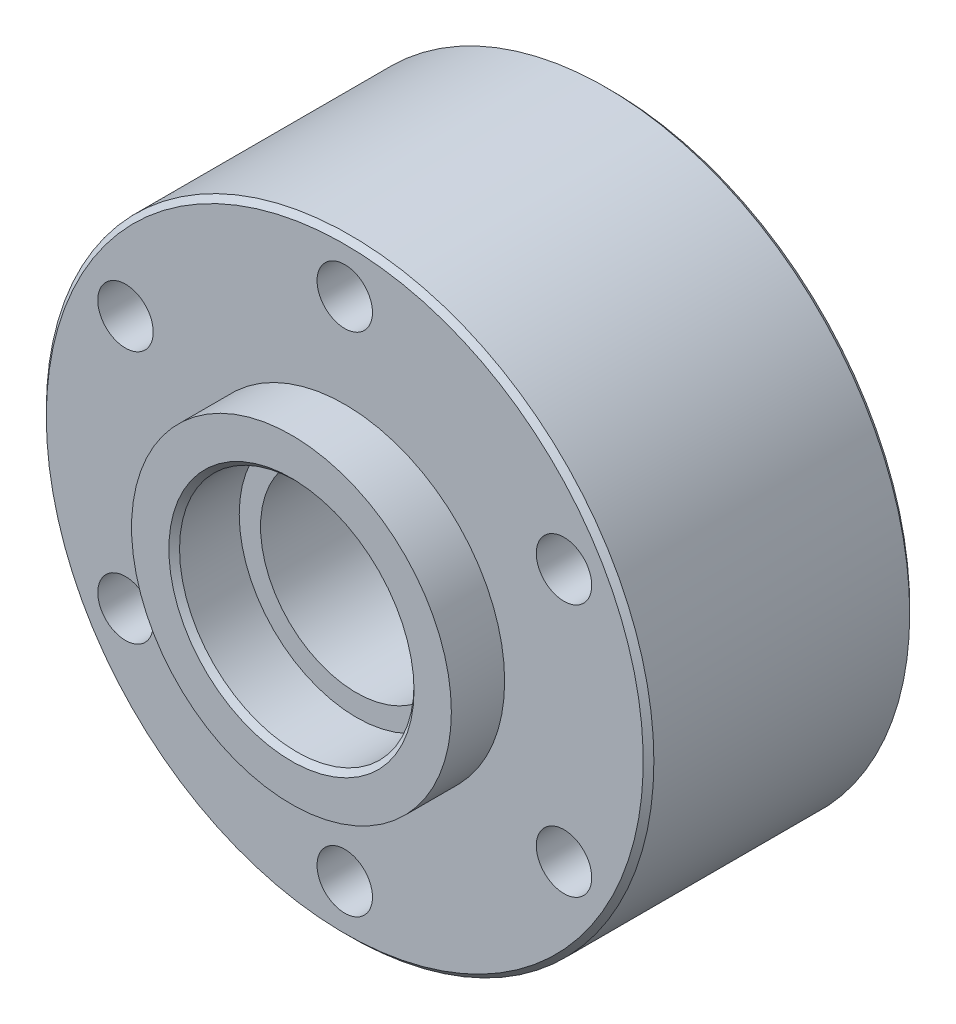
ISO-10303-21;
HEADER;
FILE_DESCRIPTION(('STEP AP214'),'2;1');
FILE_NAME('part.step','',(''),(''),'','','');
FILE_SCHEMA(('AUTOMOTIVE_DESIGN { 1 0 10303 214 1 1 1 1 }'));
ENDSEC;
DATA;
#1=APPLICATION_CONTEXT('core data for automotive mechanical design processes');
#2=APPLICATION_PROTOCOL_DEFINITION('international standard','automotive_design',2000,#1);
#3=PRODUCT_CONTEXT('',#1,'mechanical');
#4=PRODUCT('Part','Part','',(#3));
#5=PRODUCT_RELATED_PRODUCT_CATEGORY('part','',(#4));
#6=PRODUCT_DEFINITION_FORMATION('','',#4);
#7=PRODUCT_DEFINITION_CONTEXT('part definition',#1,'design');
#8=PRODUCT_DEFINITION('design','',#6,#7);
#9=PRODUCT_DEFINITION_SHAPE('','',#8);
#10=(LENGTH_UNIT() NAMED_UNIT(*) SI_UNIT(.MILLI.,.METRE.));
#11=(NAMED_UNIT(*) PLANE_ANGLE_UNIT() SI_UNIT($,.RADIAN.));
#12=(NAMED_UNIT(*) SI_UNIT($,.STERADIAN.) SOLID_ANGLE_UNIT());
#13=UNCERTAINTY_MEASURE_WITH_UNIT(LENGTH_MEASURE(1.E-05),#10,'distance_accuracy_value','');
#14=(GEOMETRIC_REPRESENTATION_CONTEXT(3) GLOBAL_UNCERTAINTY_ASSIGNED_CONTEXT((#13)) GLOBAL_UNIT_ASSIGNED_CONTEXT((#10,
#11,#12)) REPRESENTATION_CONTEXT('',''));
#15=CARTESIAN_POINT('',(0.,0.,0.));
#16=DIRECTION('',(0.,0.,1.));
#17=DIRECTION('',(1.,0.,0.));
#18=AXIS2_PLACEMENT_3D('',#15,#16,#17);
#19=CARTESIAN_POINT('',(0.,0.,-11.4));
#20=DIRECTION('',(0.,0.,1.));
#21=DIRECTION('',(1.,0.,0.));
#22=AXIS2_PLACEMENT_3D('',#19,#20,#21);
#23=CYLINDRICAL_SURFACE('',#22,9.);
#24=CARTESIAN_POINT('',(0.,0.,-11.4));
#25=DIRECTION('',(0.,0.,1.));
#26=DIRECTION('',(1.,0.,0.));
#27=AXIS2_PLACEMENT_3D('',#24,#25,#26);
#28=CIRCLE('',#27,9.);
#29=CARTESIAN_POINT('',(9.,0.,-11.4));
#30=VERTEX_POINT('',#29);
#31=EDGE_CURVE('E17',#30,#30,#28,.F.);
#32=ORIENTED_EDGE('',*,*,#31,.T.);
#33=EDGE_LOOP('',(#32));
#34=FACE_BOUND('',#33,.T.);
#35=CARTESIAN_POINT('',(0.,0.,11.4));
#36=DIRECTION('',(0.,0.,1.));
#37=DIRECTION('',(1.,0.,0.));
#38=AXIS2_PLACEMENT_3D('',#35,#36,#37);
#39=CIRCLE('',#38,9.);
#40=CARTESIAN_POINT('',(9.,0.,11.4));
#41=VERTEX_POINT('',#40);
#42=EDGE_CURVE('E99',#41,#41,#39,.T.);
#43=ORIENTED_EDGE('',*,*,#42,.T.);
#44=EDGE_LOOP('',(#43));
#45=FACE_BOUND('',#44,.T.);
#46=ADVANCED_FACE('F14',(#34,#45),#23,.F.);
#47=CARTESIAN_POINT('',(-11.132,-11.132,-11.4));
#48=DIRECTION('',(0.,0.,1.));
#49=DIRECTION('',(1.,0.,0.));
#50=AXIS2_PLACEMENT_3D('',#47,#48,#49);
#51=PLANE('',#50);
#52=CARTESIAN_POINT('',(0.,0.,-11.4));
#53=DIRECTION('',(0.,0.,1.));
#54=DIRECTION('',(1.,0.,0.));
#55=AXIS2_PLACEMENT_3D('',#52,#53,#54);
#56=CIRCLE('',#55,11.);
#57=CARTESIAN_POINT('',(11.,0.,-11.4));
#58=VERTEX_POINT('',#57);
#59=EDGE_CURVE('E97',#58,#58,#56,.F.);
#60=ORIENTED_EDGE('',*,*,#59,.T.);
#61=EDGE_LOOP('',(#60));
#62=FACE_BOUND('',#61,.T.);
#63=ORIENTED_EDGE('',*,*,#31,.F.);
#64=EDGE_LOOP('',(#63));
#65=FACE_BOUND('',#64,.T.);
#66=ADVANCED_FACE('F107',(#62,#65),#51,.F.);
#67=CARTESIAN_POINT('',(11.132,-11.132,11.4));
#68=DIRECTION('',(0.,0.,-1.));
#69=DIRECTION('',(-1.,0.,0.));
#70=AXIS2_PLACEMENT_3D('',#67,#68,#69);
#71=PLANE('',#70);
#72=CARTESIAN_POINT('',(0.,0.,11.4));
#73=DIRECTION('',(0.,0.,1.));
#74=DIRECTION('',(1.,0.,0.));
#75=AXIS2_PLACEMENT_3D('',#72,#73,#74);
#76=CIRCLE('',#75,11.);
#77=CARTESIAN_POINT('',(11.,0.,11.4));
#78=VERTEX_POINT('',#77);
#79=EDGE_CURVE('E36',#78,#78,#76,.T.);
#80=ORIENTED_EDGE('',*,*,#79,.T.);
#81=EDGE_LOOP('',(#80));
#82=FACE_BOUND('',#81,.T.);
#83=ORIENTED_EDGE('',*,*,#42,.F.);
#84=EDGE_LOOP('',(#83));
#85=FACE_BOUND('',#84,.T.);
#86=ADVANCED_FACE('F109',(#82,#85),#71,.F.);
#87=CARTESIAN_POINT('',(0.,0.,-17.));
#88=DIRECTION('',(0.,0.,1.));
#89=DIRECTION('',(1.,0.,0.));
#90=AXIS2_PLACEMENT_3D('',#87,#88,#89);
#91=CYLINDRICAL_SURFACE('',#90,11.);
#92=CARTESIAN_POINT('',(0.,0.,-17.));
#93=DIRECTION('',(0.,0.,-1.));
#94=DIRECTION('',(-1.,0.,0.));
#95=AXIS2_PLACEMENT_3D('',#92,#93,#94);
#96=CIRCLE('',#95,11.);
#97=CARTESIAN_POINT('',(-11.,0.,-17.));
#98=VERTEX_POINT('',#97);
#99=EDGE_CURVE('E33',#98,#98,#96,.T.);
#100=ORIENTED_EDGE('',*,*,#99,.T.);
#101=EDGE_LOOP('',(#100));
#102=FACE_BOUND('',#101,.T.);
#103=ORIENTED_EDGE('',*,*,#59,.F.);
#104=EDGE_LOOP('',(#103));
#105=FACE_BOUND('',#104,.T.);
#106=ADVANCED_FACE('F116',(#102,#105),#91,.F.);
#107=CARTESIAN_POINT('',(0.,0.,11.4));
#108=DIRECTION('',(0.,0.,1.));
#109=DIRECTION('',(1.,0.,0.));
#110=AXIS2_PLACEMENT_3D('',#107,#108,#109);
#111=CYLINDRICAL_SURFACE('',#110,11.);
#112=ORIENTED_EDGE('',*,*,#79,.F.);
#113=EDGE_LOOP('',(#112));
#114=FACE_BOUND('',#113,.T.);
#115=CARTESIAN_POINT('',(0.,0.,17.));
#116=DIRECTION('',(0.,0.,1.));
#117=DIRECTION('',(1.,0.,0.));
#118=AXIS2_PLACEMENT_3D('',#115,#116,#117);
#119=CIRCLE('',#118,11.);
#120=CARTESIAN_POINT('',(11.,0.,17.));
#121=VERTEX_POINT('',#120);
#122=EDGE_CURVE('E29',#121,#121,#119,.T.);
#123=ORIENTED_EDGE('',*,*,#122,.T.);
#124=EDGE_LOOP('',(#123));
#125=FACE_BOUND('',#124,.T.);
#126=ADVANCED_FACE('F189',(#114,#125),#111,.F.);
#127=CARTESIAN_POINT('',(0.,0.,-17.5));
#128=DIRECTION('',(0.,0.,-1.));
#129=DIRECTION('',(-1.,0.,0.));
#130=AXIS2_PLACEMENT_3D('',#127,#128,#129);
#131=CONICAL_SURFACE('',#130,11.5,0.785398163397448);
#132=ORIENTED_EDGE('',*,*,#99,.F.);
#133=EDGE_LOOP('',(#132));
#134=FACE_BOUND('',#133,.T.);
#135=CARTESIAN_POINT('',(0.,0.,-17.5));
#136=DIRECTION('',(0.,0.,-1.));
#137=DIRECTION('',(-1.,0.,0.));
#138=AXIS2_PLACEMENT_3D('',#135,#136,#137);
#139=CIRCLE('',#138,11.5);
#140=CARTESIAN_POINT('',(-11.5,0.,-17.5));
#141=VERTEX_POINT('',#140);
#142=EDGE_CURVE('E32',#141,#141,#139,.T.);
#143=ORIENTED_EDGE('',*,*,#142,.T.);
#144=EDGE_LOOP('',(#143));
#145=FACE_BOUND('',#144,.T.);
#146=ADVANCED_FACE('F185',(#134,#145),#131,.F.);
#147=CARTESIAN_POINT('',(0.,0.,17.5));
#148=DIRECTION('',(0.,0.,1.));
#149=DIRECTION('',(1.,0.,0.));
#150=AXIS2_PLACEMENT_3D('',#147,#148,#149);
#151=CONICAL_SURFACE('',#150,11.5,0.785398163397448);
#152=ORIENTED_EDGE('',*,*,#122,.F.);
#153=EDGE_LOOP('',(#152));
#154=FACE_BOUND('',#153,.T.);
#155=CARTESIAN_POINT('',(0.,0.,17.5));
#156=DIRECTION('',(0.,0.,1.));
#157=DIRECTION('',(1.,0.,0.));
#158=AXIS2_PLACEMENT_3D('',#155,#156,#157);
#159=CIRCLE('',#158,11.5);
#160=CARTESIAN_POINT('',(11.5,0.,17.5));
#161=VERTEX_POINT('',#160);
#162=EDGE_CURVE('E90',#161,#161,#159,.T.);
#163=ORIENTED_EDGE('',*,*,#162,.T.);
#164=EDGE_LOOP('',(#163));
#165=FACE_BOUND('',#164,.T.);
#166=ADVANCED_FACE('F181',(#154,#165),#151,.F.);
#167=CARTESIAN_POINT('',(-15.18,-15.18,-17.5));
#168=DIRECTION('',(0.,0.,1.));
#169=DIRECTION('',(1.,0.,0.));
#170=AXIS2_PLACEMENT_3D('',#167,#168,#169);
#171=PLANE('',#170);
#172=CARTESIAN_POINT('',(0.,0.,-17.5));
#173=DIRECTION('',(0.,0.,1.));
#174=DIRECTION('',(1.,0.,0.));
#175=AXIS2_PLACEMENT_3D('',#172,#173,#174);
#176=CIRCLE('',#175,15.);
#177=CARTESIAN_POINT('',(15.,0.,-17.5));
#178=VERTEX_POINT('',#177);
#179=EDGE_CURVE('E87',#178,#178,#176,.T.);
#180=ORIENTED_EDGE('',*,*,#179,.F.);
#181=EDGE_LOOP('',(#180));
#182=FACE_BOUND('',#181,.T.);
#183=ORIENTED_EDGE('',*,*,#142,.F.);
#184=EDGE_LOOP('',(#183));
#185=FACE_BOUND('',#184,.T.);
#186=ADVANCED_FACE('F177',(#182,#185),#171,.F.);
#187=CARTESIAN_POINT('',(15.18,-15.18,17.5));
#188=DIRECTION('',(0.,0.,-1.));
#189=DIRECTION('',(-1.,0.,0.));
#190=AXIS2_PLACEMENT_3D('',#187,#188,#189);
#191=PLANE('',#190);
#192=CARTESIAN_POINT('',(0.,0.,17.5));
#193=DIRECTION('',(0.,0.,1.));
#194=DIRECTION('',(1.,0.,0.));
#195=AXIS2_PLACEMENT_3D('',#192,#193,#194);
#196=CIRCLE('',#195,15.);
#197=CARTESIAN_POINT('',(15.,0.,17.5));
#198=VERTEX_POINT('',#197);
#199=EDGE_CURVE('E84',#198,#198,#196,.F.);
#200=ORIENTED_EDGE('',*,*,#199,.F.);
#201=EDGE_LOOP('',(#200));
#202=FACE_BOUND('',#201,.T.);
#203=ORIENTED_EDGE('',*,*,#162,.F.);
#204=EDGE_LOOP('',(#203));
#205=FACE_BOUND('',#204,.T.);
#206=ADVANCED_FACE('F173',(#202,#205),#191,.F.);
#207=CARTESIAN_POINT('',(0.,0.,-17.5));
#208=DIRECTION('',(0.,0.,1.));
#209=DIRECTION('',(1.,0.,0.));
#210=AXIS2_PLACEMENT_3D('',#207,#208,#209);
#211=CYLINDRICAL_SURFACE('',#210,15.);
#212=ORIENTED_EDGE('',*,*,#179,.T.);
#213=EDGE_LOOP('',(#212));
#214=FACE_BOUND('',#213,.T.);
#215=CARTESIAN_POINT('',(0.,0.,-12.5));
#216=DIRECTION('',(0.,0.,1.));
#217=DIRECTION('',(1.,0.,0.));
#218=AXIS2_PLACEMENT_3D('',#215,#216,#217);
#219=CIRCLE('',#218,15.);
#220=CARTESIAN_POINT('',(15.,0.,-12.5));
#221=VERTEX_POINT('',#220);
#222=EDGE_CURVE('E81',#221,#221,#219,.F.);
#223=ORIENTED_EDGE('',*,*,#222,.T.);
#224=EDGE_LOOP('',(#223));
#225=FACE_BOUND('',#224,.T.);
#226=ADVANCED_FACE('F169',(#214,#225),#211,.T.);
#227=CARTESIAN_POINT('',(0.,0.,12.5));
#228=DIRECTION('',(0.,0.,1.));
#229=DIRECTION('',(1.,0.,0.));
#230=AXIS2_PLACEMENT_3D('',#227,#228,#229);
#231=CYLINDRICAL_SURFACE('',#230,15.);
#232=ORIENTED_EDGE('',*,*,#199,.T.);
#233=EDGE_LOOP('',(#232));
#234=FACE_BOUND('',#233,.T.);
#235=CARTESIAN_POINT('',(0.,0.,12.5));
#236=DIRECTION('',(0.,0.,1.));
#237=DIRECTION('',(1.,0.,0.));
#238=AXIS2_PLACEMENT_3D('',#235,#236,#237);
#239=CIRCLE('',#238,15.);
#240=CARTESIAN_POINT('',(15.,0.,12.5));
#241=VERTEX_POINT('',#240);
#242=EDGE_CURVE('E60',#241,#241,#239,.T.);
#243=ORIENTED_EDGE('',*,*,#242,.T.);
#244=EDGE_LOOP('',(#243));
#245=FACE_BOUND('',#244,.T.);
#246=ADVANCED_FACE('F165',(#234,#245),#231,.T.);
#247=CARTESIAN_POINT('',(0.,23.75,-12.5));
#248=DIRECTION('',(0.,0.,1.));
#249=DIRECTION('',(1.,0.,0.));
#250=AXIS2_PLACEMENT_3D('',#247,#248,#249);
#251=CYLINDRICAL_SURFACE('',#250,2.6);
#252=CARTESIAN_POINT('',(0.,23.75,-12.5));
#253=DIRECTION('',(0.,0.,1.));
#254=DIRECTION('',(1.,0.,0.));
#255=AXIS2_PLACEMENT_3D('',#252,#253,#254);
#256=CIRCLE('',#255,2.6);
#257=CARTESIAN_POINT('',(2.6,23.75,-12.5));
#258=VERTEX_POINT('',#257);
#259=EDGE_CURVE('E78',#258,#258,#256,.F.);
#260=ORIENTED_EDGE('',*,*,#259,.T.);
#261=EDGE_LOOP('',(#260));
#262=FACE_BOUND('',#261,.T.);
#263=CARTESIAN_POINT('',(0.,23.75,12.5));
#264=DIRECTION('',(0.,0.,1.));
#265=DIRECTION('',(1.,0.,0.));
#266=AXIS2_PLACEMENT_3D('',#263,#264,#265);
#267=CIRCLE('',#266,2.6);
#268=CARTESIAN_POINT('',(2.6,23.75,12.5));
#269=VERTEX_POINT('',#268);
#270=EDGE_CURVE('E57',#269,#269,#267,.T.);
#271=ORIENTED_EDGE('',*,*,#270,.T.);
#272=EDGE_LOOP('',(#271));
#273=FACE_BOUND('',#272,.T.);
#274=ADVANCED_FACE('F161',(#262,#273),#251,.F.);
#275=CARTESIAN_POINT('',(-20.56810334,11.875,-12.5));
#276=DIRECTION('',(0.,0.,1.));
#277=DIRECTION('',(1.,0.,0.));
#278=AXIS2_PLACEMENT_3D('',#275,#276,#277);
#279=CYLINDRICAL_SURFACE('',#278,2.6);
#280=CARTESIAN_POINT('',(-20.56810334,11.875,-12.5));
#281=DIRECTION('',(0.,0.,1.));
#282=DIRECTION('',(1.,0.,0.));
#283=AXIS2_PLACEMENT_3D('',#280,#281,#282);
#284=CIRCLE('',#283,2.6);
#285=CARTESIAN_POINT('',(-17.96810334,11.875,-12.5));
#286=VERTEX_POINT('',#285);
#287=EDGE_CURVE('E75',#286,#286,#284,.F.);
#288=ORIENTED_EDGE('',*,*,#287,.T.);
#289=EDGE_LOOP('',(#288));
#290=FACE_BOUND('',#289,.T.);
#291=CARTESIAN_POINT('',(-20.56810334,11.875,12.5));
#292=DIRECTION('',(0.,0.,1.));
#293=DIRECTION('',(1.,0.,0.));
#294=AXIS2_PLACEMENT_3D('',#291,#292,#293);
#295=CIRCLE('',#294,2.6);
#296=CARTESIAN_POINT('',(-17.96810334,11.875,12.5));
#297=VERTEX_POINT('',#296);
#298=EDGE_CURVE('E54',#297,#297,#295,.T.);
#299=ORIENTED_EDGE('',*,*,#298,.T.);
#300=EDGE_LOOP('',(#299));
#301=FACE_BOUND('',#300,.T.);
#302=ADVANCED_FACE('F157',(#290,#301),#279,.F.);
#303=CARTESIAN_POINT('',(-20.56810334,-11.875,-12.5));
#304=DIRECTION('',(0.,0.,1.));
#305=DIRECTION('',(1.,0.,0.));
#306=AXIS2_PLACEMENT_3D('',#303,#304,#305);
#307=CYLINDRICAL_SURFACE('',#306,2.6);
#308=CARTESIAN_POINT('',(-20.56810334,-11.875,-12.5));
#309=DIRECTION('',(0.,0.,1.));
#310=DIRECTION('',(1.,0.,0.));
#311=AXIS2_PLACEMENT_3D('',#308,#309,#310);
#312=CIRCLE('',#311,2.6);
#313=CARTESIAN_POINT('',(-17.96810334,-11.875,-12.5));
#314=VERTEX_POINT('',#313);
#315=EDGE_CURVE('E72',#314,#314,#312,.F.);
#316=ORIENTED_EDGE('',*,*,#315,.T.);
#317=EDGE_LOOP('',(#316));
#318=FACE_BOUND('',#317,.T.);
#319=CARTESIAN_POINT('',(-20.56810334,-11.875,12.5));
#320=DIRECTION('',(0.,0.,1.));
#321=DIRECTION('',(1.,0.,0.));
#322=AXIS2_PLACEMENT_3D('',#319,#320,#321);
#323=CIRCLE('',#322,2.6);
#324=CARTESIAN_POINT('',(-17.96810334,-11.875,12.5));
#325=VERTEX_POINT('',#324);
#326=EDGE_CURVE('E51',#325,#325,#323,.T.);
#327=ORIENTED_EDGE('',*,*,#326,.T.);
#328=EDGE_LOOP('',(#327));
#329=FACE_BOUND('',#328,.T.);
#330=ADVANCED_FACE('F153',(#318,#329),#307,.F.);
#331=CARTESIAN_POINT('',(0.,-23.75,-12.5));
#332=DIRECTION('',(0.,0.,1.));
#333=DIRECTION('',(1.,0.,0.));
#334=AXIS2_PLACEMENT_3D('',#331,#332,#333);
#335=CYLINDRICAL_SURFACE('',#334,2.6);
#336=CARTESIAN_POINT('',(0.,-23.75,-12.5));
#337=DIRECTION('',(0.,0.,1.));
#338=DIRECTION('',(1.,0.,0.));
#339=AXIS2_PLACEMENT_3D('',#336,#337,#338);
#340=CIRCLE('',#339,2.6);
#341=CARTESIAN_POINT('',(2.6,-23.75,-12.5));
#342=VERTEX_POINT('',#341);
#343=EDGE_CURVE('E69',#342,#342,#340,.F.);
#344=ORIENTED_EDGE('',*,*,#343,.T.);
#345=EDGE_LOOP('',(#344));
#346=FACE_BOUND('',#345,.T.);
#347=CARTESIAN_POINT('',(0.,-23.75,12.5));
#348=DIRECTION('',(0.,0.,1.));
#349=DIRECTION('',(1.,0.,0.));
#350=AXIS2_PLACEMENT_3D('',#347,#348,#349);
#351=CIRCLE('',#350,2.6);
#352=CARTESIAN_POINT('',(2.6,-23.75,12.5));
#353=VERTEX_POINT('',#352);
#354=EDGE_CURVE('E48',#353,#353,#351,.T.);
#355=ORIENTED_EDGE('',*,*,#354,.T.);
#356=EDGE_LOOP('',(#355));
#357=FACE_BOUND('',#356,.T.);
#358=ADVANCED_FACE('F149',(#346,#357),#335,.F.);
#359=CARTESIAN_POINT('',(20.56810334,-11.875,-12.5));
#360=DIRECTION('',(0.,0.,1.));
#361=DIRECTION('',(1.,0.,0.));
#362=AXIS2_PLACEMENT_3D('',#359,#360,#361);
#363=CYLINDRICAL_SURFACE('',#362,2.6);
#364=CARTESIAN_POINT('',(20.56810334,-11.875,-12.5));
#365=DIRECTION('',(0.,0.,1.));
#366=DIRECTION('',(1.,0.,0.));
#367=AXIS2_PLACEMENT_3D('',#364,#365,#366);
#368=CIRCLE('',#367,2.6);
#369=CARTESIAN_POINT('',(23.16810334,-11.875,-12.5));
#370=VERTEX_POINT('',#369);
#371=EDGE_CURVE('E66',#370,#370,#368,.F.);
#372=ORIENTED_EDGE('',*,*,#371,.T.);
#373=EDGE_LOOP('',(#372));
#374=FACE_BOUND('',#373,.T.);
#375=CARTESIAN_POINT('',(20.56810334,-11.875,12.5));
#376=DIRECTION('',(0.,0.,1.));
#377=DIRECTION('',(1.,0.,0.));
#378=AXIS2_PLACEMENT_3D('',#375,#376,#377);
#379=CIRCLE('',#378,2.6);
#380=CARTESIAN_POINT('',(23.16810334,-11.875,12.5));
#381=VERTEX_POINT('',#380);
#382=EDGE_CURVE('E45',#381,#381,#379,.T.);
#383=ORIENTED_EDGE('',*,*,#382,.T.);
#384=EDGE_LOOP('',(#383));
#385=FACE_BOUND('',#384,.T.);
#386=ADVANCED_FACE('F145',(#374,#385),#363,.F.);
#387=CARTESIAN_POINT('',(20.56810334,11.875,-12.5));
#388=DIRECTION('',(0.,0.,1.));
#389=DIRECTION('',(1.,0.,0.));
#390=AXIS2_PLACEMENT_3D('',#387,#388,#389);
#391=CYLINDRICAL_SURFACE('',#390,2.6);
#392=CARTESIAN_POINT('',(20.56810334,11.875,-12.5));
#393=DIRECTION('',(0.,0.,1.));
#394=DIRECTION('',(1.,0.,0.));
#395=AXIS2_PLACEMENT_3D('',#392,#393,#394);
#396=CIRCLE('',#395,2.6);
#397=CARTESIAN_POINT('',(23.16810334,11.875,-12.5));
#398=VERTEX_POINT('',#397);
#399=EDGE_CURVE('E63',#398,#398,#396,.F.);
#400=ORIENTED_EDGE('',*,*,#399,.T.);
#401=EDGE_LOOP('',(#400));
#402=FACE_BOUND('',#401,.T.);
#403=CARTESIAN_POINT('',(20.56810334,11.875,12.5));
#404=DIRECTION('',(0.,0.,1.));
#405=DIRECTION('',(1.,0.,0.));
#406=AXIS2_PLACEMENT_3D('',#403,#404,#405);
#407=CIRCLE('',#406,2.6);
#408=CARTESIAN_POINT('',(23.16810334,11.875,12.5));
#409=VERTEX_POINT('',#408);
#410=EDGE_CURVE('E42',#409,#409,#407,.T.);
#411=ORIENTED_EDGE('',*,*,#410,.T.);
#412=EDGE_LOOP('',(#411));
#413=FACE_BOUND('',#412,.T.);
#414=ADVANCED_FACE('F141',(#402,#413),#391,.F.);
#415=CARTESIAN_POINT('',(-28.336,-28.336,-12.5));
#416=DIRECTION('',(0.,0.,1.));
#417=DIRECTION('',(1.,0.,0.));
#418=AXIS2_PLACEMENT_3D('',#415,#416,#417);
#419=PLANE('',#418);
#420=CARTESIAN_POINT('',(0.,0.,-12.5));
#421=DIRECTION('',(0.,0.,1.));
#422=DIRECTION('',(0.,-1.,0.));
#423=AXIS2_PLACEMENT_3D('',#420,#421,#422);
#424=CIRCLE('',#423,28.);
#425=CARTESIAN_POINT('',(0.,-28.,-12.5));
#426=VERTEX_POINT('',#425);
#427=EDGE_CURVE('E39',#426,#426,#424,.T.);
#428=ORIENTED_EDGE('',*,*,#427,.F.);
#429=EDGE_LOOP('',(#428));
#430=FACE_BOUND('',#429,.T.);
#431=ORIENTED_EDGE('',*,*,#399,.F.);
#432=EDGE_LOOP('',(#431));
#433=FACE_BOUND('',#432,.T.);
#434=ORIENTED_EDGE('',*,*,#371,.F.);
#435=EDGE_LOOP('',(#434));
#436=FACE_BOUND('',#435,.T.);
#437=ORIENTED_EDGE('',*,*,#343,.F.);
#438=EDGE_LOOP('',(#437));
#439=FACE_BOUND('',#438,.T.);
#440=ORIENTED_EDGE('',*,*,#315,.F.);
#441=EDGE_LOOP('',(#440));
#442=FACE_BOUND('',#441,.T.);
#443=ORIENTED_EDGE('',*,*,#287,.F.);
#444=EDGE_LOOP('',(#443));
#445=FACE_BOUND('',#444,.T.);
#446=ORIENTED_EDGE('',*,*,#259,.F.);
#447=EDGE_LOOP('',(#446));
#448=FACE_BOUND('',#447,.T.);
#449=ORIENTED_EDGE('',*,*,#222,.F.);
#450=EDGE_LOOP('',(#449));
#451=FACE_BOUND('',#450,.T.);
#452=ADVANCED_FACE('F137',(#430,#433,#436,#439,#442,#445,#448,#451),#419,.F.);
#453=CARTESIAN_POINT('',(28.336,-28.336,12.5));
#454=DIRECTION('',(0.,0.,-1.));
#455=DIRECTION('',(-1.,0.,0.));
#456=AXIS2_PLACEMENT_3D('',#453,#454,#455);
#457=PLANE('',#456);
#458=CARTESIAN_POINT('',(0.,0.,12.5));
#459=DIRECTION('',(0.,0.,-1.));
#460=DIRECTION('',(-1.,0.,0.));
#461=AXIS2_PLACEMENT_3D('',#458,#459,#460);
#462=CIRCLE('',#461,28.);
#463=CARTESIAN_POINT('',(-28.,0.,12.5));
#464=VERTEX_POINT('',#463);
#465=EDGE_CURVE('E26',#464,#464,#462,.T.);
#466=ORIENTED_EDGE('',*,*,#465,.F.);
#467=EDGE_LOOP('',(#466));
#468=FACE_BOUND('',#467,.T.);
#469=ORIENTED_EDGE('',*,*,#410,.F.);
#470=EDGE_LOOP('',(#469));
#471=FACE_BOUND('',#470,.T.);
#472=ORIENTED_EDGE('',*,*,#382,.F.);
#473=EDGE_LOOP('',(#472));
#474=FACE_BOUND('',#473,.T.);
#475=ORIENTED_EDGE('',*,*,#354,.F.);
#476=EDGE_LOOP('',(#475));
#477=FACE_BOUND('',#476,.T.);
#478=ORIENTED_EDGE('',*,*,#326,.F.);
#479=EDGE_LOOP('',(#478));
#480=FACE_BOUND('',#479,.T.);
#481=ORIENTED_EDGE('',*,*,#298,.F.);
#482=EDGE_LOOP('',(#481));
#483=FACE_BOUND('',#482,.T.);
#484=ORIENTED_EDGE('',*,*,#270,.F.);
#485=EDGE_LOOP('',(#484));
#486=FACE_BOUND('',#485,.T.);
#487=ORIENTED_EDGE('',*,*,#242,.F.);
#488=EDGE_LOOP('',(#487));
#489=FACE_BOUND('',#488,.T.);
#490=ADVANCED_FACE('F133',(#468,#471,#474,#477,#480,#483,#486,#489),#457,.F.);
#491=CARTESIAN_POINT('',(0.,0.,-12.));
#492=DIRECTION('',(0.,0.,1.));
#493=DIRECTION('',(0.,-1.,0.));
#494=AXIS2_PLACEMENT_3D('',#491,#492,#493);
#495=CONICAL_SURFACE('',#494,28.5,0.785398163397448);
#496=ORIENTED_EDGE('',*,*,#427,.T.);
#497=EDGE_LOOP('',(#496));
#498=FACE_BOUND('',#497,.T.);
#499=CARTESIAN_POINT('',(0.,0.,-12.));
#500=DIRECTION('',(0.,0.,1.));
#501=DIRECTION('',(1.,0.,0.));
#502=AXIS2_PLACEMENT_3D('',#499,#500,#501);
#503=CIRCLE('',#502,28.5);
#504=CARTESIAN_POINT('',(28.5,0.,-12.));
#505=VERTEX_POINT('',#504);
#506=EDGE_CURVE('E21',#505,#505,#503,.T.);
#507=ORIENTED_EDGE('',*,*,#506,.F.);
#508=EDGE_LOOP('',(#507));
#509=FACE_BOUND('',#508,.T.);
#510=ADVANCED_FACE('F127',(#498,#509),#495,.T.);
#511=CARTESIAN_POINT('',(0.,0.,12.));
#512=DIRECTION('',(0.,0.,-1.));
#513=DIRECTION('',(-1.,0.,0.));
#514=AXIS2_PLACEMENT_3D('',#511,#512,#513);
#515=CONICAL_SURFACE('',#514,28.5,0.785398163397448);
#516=CARTESIAN_POINT('',(0.,0.,12.));
#517=DIRECTION('',(0.,0.,1.));
#518=DIRECTION('',(1.,0.,0.));
#519=AXIS2_PLACEMENT_3D('',#516,#517,#518);
#520=CIRCLE('',#519,28.5);
#521=CARTESIAN_POINT('',(28.5,0.,12.));
#522=VERTEX_POINT('',#521);
#523=EDGE_CURVE('E10',#522,#522,#520,.F.);
#524=ORIENTED_EDGE('',*,*,#523,.F.);
#525=EDGE_LOOP('',(#524));
#526=FACE_BOUND('',#525,.T.);
#527=ORIENTED_EDGE('',*,*,#465,.T.);
#528=EDGE_LOOP('',(#527));
#529=FACE_BOUND('',#528,.T.);
#530=ADVANCED_FACE('F121',(#526,#529),#515,.T.);
#531=CARTESIAN_POINT('',(0.,0.,-12.));
#532=DIRECTION('',(0.,0.,1.));
#533=DIRECTION('',(1.,0.,0.));
#534=AXIS2_PLACEMENT_3D('',#531,#532,#533);
#535=CYLINDRICAL_SURFACE('',#534,28.5);
#536=ORIENTED_EDGE('',*,*,#506,.T.);
#537=EDGE_LOOP('',(#536));
#538=FACE_BOUND('',#537,.T.);
#539=ORIENTED_EDGE('',*,*,#523,.T.);
#540=EDGE_LOOP('',(#539));
#541=FACE_BOUND('',#540,.T.);
#542=ADVANCED_FACE('F119',(#538,#541),#535,.T.);
#543=CLOSED_SHELL('',(#46,#66,#86,#106,#126,#146,#166,#186,#206,#226,#246,#274,#302,#330,#358,
#386,#414,#452,#490,#510,#530,#542));
#544=MANIFOLD_SOLID_BREP('B1',#543);
#545=ADVANCED_BREP_SHAPE_REPRESENTATION('',(#18,#544),#14);
#546=SHAPE_DEFINITION_REPRESENTATION(#9,#545);
ENDSEC;
END-ISO-10303-21;
